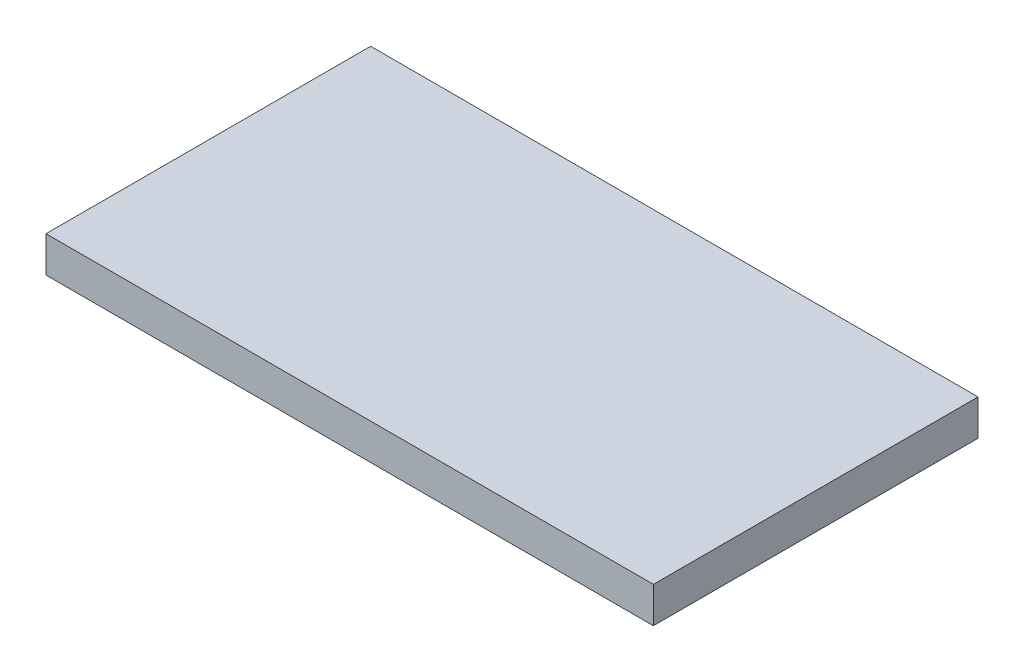
ISO-10303-21;
HEADER;
FILE_DESCRIPTION(('STEP AP214'),'2;1');
FILE_NAME('part.step','',(''),(''),'','','');
FILE_SCHEMA(('AUTOMOTIVE_DESIGN { 1 0 10303 214 1 1 1 1 }'));
ENDSEC;
DATA;
#1=APPLICATION_CONTEXT('core data for automotive mechanical design processes');
#2=APPLICATION_PROTOCOL_DEFINITION('international standard','automotive_design',2000,#1);
#3=PRODUCT_CONTEXT('',#1,'mechanical');
#4=PRODUCT('Part','Part','',(#3));
#5=PRODUCT_RELATED_PRODUCT_CATEGORY('part','',(#4));
#6=PRODUCT_DEFINITION_FORMATION('','',#4);
#7=PRODUCT_DEFINITION_CONTEXT('part definition',#1,'design');
#8=PRODUCT_DEFINITION('design','',#6,#7);
#9=PRODUCT_DEFINITION_SHAPE('','',#8);
#10=(LENGTH_UNIT() NAMED_UNIT(*) SI_UNIT(.MILLI.,.METRE.));
#11=(NAMED_UNIT(*) PLANE_ANGLE_UNIT() SI_UNIT($,.RADIAN.));
#12=(NAMED_UNIT(*) SI_UNIT($,.STERADIAN.) SOLID_ANGLE_UNIT());
#13=UNCERTAINTY_MEASURE_WITH_UNIT(LENGTH_MEASURE(1.E-05),#10,'distance_accuracy_value','');
#14=(GEOMETRIC_REPRESENTATION_CONTEXT(3) GLOBAL_UNCERTAINTY_ASSIGNED_CONTEXT((#13)) GLOBAL_UNIT_ASSIGNED_CONTEXT((#10,
#11,#12)) REPRESENTATION_CONTEXT('',''));
#15=CARTESIAN_POINT('',(0.,0.,0.));
#16=DIRECTION('',(0.,0.,1.));
#17=DIRECTION('',(1.,0.,0.));
#18=AXIS2_PLACEMENT_3D('',#15,#16,#17);
#19=CARTESIAN_POINT('',(21.5319484559132,2.54,11.508455209195));
#20=DIRECTION('',(-1.,0.,0.));
#21=DIRECTION('',(0.,0.,1.));
#22=AXIS2_PLACEMENT_3D('',#19,#20,#21);
#23=PLANE('',#22);
#24=DIRECTION('',(0.,0.,-1.));
#25=VECTOR('',#24,1.);
#26=CARTESIAN_POINT('',(21.5319484559132,0.,11.508455209195));
#27=LINE('',#26,#25);
#28=CARTESIAN_POINT('',(21.5319484559132,0.,11.508455209195));
#29=VERTEX_POINT('',#28);
#30=CARTESIAN_POINT('',(21.5319484559132,0.,-11.508455209195));
#31=VERTEX_POINT('',#30);
#32=EDGE_CURVE('E111',#29,#31,#27,.T.);
#33=ORIENTED_EDGE('',*,*,#32,.T.);
#34=DIRECTION('',(0.,-1.,0.));
#35=VECTOR('',#34,1.);
#36=CARTESIAN_POINT('',(21.5319484559132,2.54,-11.508455209195));
#37=LINE('',#36,#35);
#38=CARTESIAN_POINT('',(21.5319484559132,2.54,-11.508455209195));
#39=VERTEX_POINT('',#38);
#40=EDGE_CURVE('E11',#39,#31,#37,.T.);
#41=ORIENTED_EDGE('',*,*,#40,.F.);
#42=DIRECTION('',(0.,0.,-1.));
#43=VECTOR('',#42,1.);
#44=CARTESIAN_POINT('',(21.5319484559132,2.54,11.508455209195));
#45=LINE('',#44,#43);
#46=CARTESIAN_POINT('',(21.5319484559132,2.54,11.508455209195));
#47=VERTEX_POINT('',#46);
#48=EDGE_CURVE('E95',#47,#39,#45,.T.);
#49=ORIENTED_EDGE('',*,*,#48,.F.);
#50=DIRECTION('',(0.,-1.,0.));
#51=VECTOR('',#50,1.);
#52=CARTESIAN_POINT('',(21.5319484559132,2.54,11.508455209195));
#53=LINE('',#52,#51);
#54=EDGE_CURVE('E107',#47,#29,#53,.T.);
#55=ORIENTED_EDGE('',*,*,#54,.T.);
#56=EDGE_LOOP('',(#33,#41,#49,#55));
#57=FACE_BOUND('',#56,.T.);
#58=ADVANCED_FACE('F43',(#57),#23,.F.);
#59=CARTESIAN_POINT('',(-21.5319484559132,2.54,-11.508455209195));
#60=DIRECTION('',(0.,0.,1.));
#61=DIRECTION('',(1.,0.,0.));
#62=AXIS2_PLACEMENT_3D('',#59,#60,#61);
#63=PLANE('',#62);
#64=DIRECTION('',(-1.,0.,0.));
#65=VECTOR('',#64,1.);
#66=CARTESIAN_POINT('',(-21.5319484559132,0.,-11.508455209195));
#67=LINE('',#66,#65);
#68=CARTESIAN_POINT('',(-21.5319484559132,0.,-11.508455209195));
#69=VERTEX_POINT('',#68);
#70=EDGE_CURVE('E100',#31,#69,#67,.T.);
#71=ORIENTED_EDGE('',*,*,#70,.T.);
#72=DIRECTION('',(0.,-1.,0.));
#73=VECTOR('',#72,1.);
#74=CARTESIAN_POINT('',(-21.5319484559132,2.54,-11.508455209195));
#75=LINE('',#74,#73);
#76=CARTESIAN_POINT('',(-21.5319484559132,2.54,-11.508455209195));
#77=VERTEX_POINT('',#76);
#78=EDGE_CURVE('E52',#77,#69,#75,.T.);
#79=ORIENTED_EDGE('',*,*,#78,.F.);
#80=DIRECTION('',(-1.,0.,0.));
#81=VECTOR('',#80,1.);
#82=CARTESIAN_POINT('',(-21.5319484559132,2.54,-11.508455209195));
#83=LINE('',#82,#81);
#84=EDGE_CURVE('E90',#39,#77,#83,.T.);
#85=ORIENTED_EDGE('',*,*,#84,.F.);
#86=ORIENTED_EDGE('',*,*,#40,.T.);
#87=EDGE_LOOP('',(#71,#79,#85,#86));
#88=FACE_BOUND('',#87,.T.);
#89=ADVANCED_FACE('F99',(#88),#63,.F.);
#90=CARTESIAN_POINT('',(-21.5319484559132,2.54,11.508455209195));
#91=DIRECTION('',(1.,0.,0.));
#92=DIRECTION('',(0.,0.,-1.));
#93=AXIS2_PLACEMENT_3D('',#90,#91,#92);
#94=PLANE('',#93);
#95=DIRECTION('',(0.,0.,1.));
#96=VECTOR('',#95,1.);
#97=CARTESIAN_POINT('',(-21.5319484559132,0.,11.508455209195));
#98=LINE('',#97,#96);
#99=CARTESIAN_POINT('',(-21.5319484559132,0.,11.508455209195));
#100=VERTEX_POINT('',#99);
#101=EDGE_CURVE('E77',#69,#100,#98,.T.);
#102=ORIENTED_EDGE('',*,*,#101,.T.);
#103=DIRECTION('',(0.,-1.,0.));
#104=VECTOR('',#103,1.);
#105=CARTESIAN_POINT('',(-21.5319484559132,2.54,11.508455209195));
#106=LINE('',#105,#104);
#107=CARTESIAN_POINT('',(-21.5319484559132,2.54,11.508455209195));
#108=VERTEX_POINT('',#107);
#109=EDGE_CURVE('E102',#108,#100,#106,.T.);
#110=ORIENTED_EDGE('',*,*,#109,.F.);
#111=DIRECTION('',(0.,0.,1.));
#112=VECTOR('',#111,1.);
#113=CARTESIAN_POINT('',(-21.5319484559132,2.54,11.508455209195));
#114=LINE('',#113,#112);
#115=EDGE_CURVE('E93',#77,#108,#114,.T.);
#116=ORIENTED_EDGE('',*,*,#115,.F.);
#117=ORIENTED_EDGE('',*,*,#78,.T.);
#118=EDGE_LOOP('',(#102,#110,#116,#117));
#119=FACE_BOUND('',#118,.T.);
#120=ADVANCED_FACE('F103',(#119),#94,.F.);
#121=CARTESIAN_POINT('',(-21.5319484559132,2.54,11.508455209195));
#122=DIRECTION('',(0.,0.,-1.));
#123=DIRECTION('',(-1.,0.,0.));
#124=AXIS2_PLACEMENT_3D('',#121,#122,#123);
#125=PLANE('',#124);
#126=DIRECTION('',(1.,0.,0.));
#127=VECTOR('',#126,1.);
#128=CARTESIAN_POINT('',(-21.5319484559132,0.,11.508455209195));
#129=LINE('',#128,#127);
#130=EDGE_CURVE('E83',#100,#29,#129,.T.);
#131=ORIENTED_EDGE('',*,*,#130,.T.);
#132=ORIENTED_EDGE('',*,*,#54,.F.);
#133=DIRECTION('',(1.,0.,0.));
#134=VECTOR('',#133,1.);
#135=CARTESIAN_POINT('',(-21.5319484559132,2.54,11.508455209195));
#136=LINE('',#135,#134);
#137=EDGE_CURVE('E60',#108,#47,#136,.T.);
#138=ORIENTED_EDGE('',*,*,#137,.F.);
#139=ORIENTED_EDGE('',*,*,#109,.T.);
#140=EDGE_LOOP('',(#131,#132,#138,#139));
#141=FACE_BOUND('',#140,.T.);
#142=ADVANCED_FACE('F124',(#141),#125,.F.);
#143=CARTESIAN_POINT('',(0.,2.54,0.));
#144=DIRECTION('',(0.,-1.,0.));
#145=DIRECTION('',(0.,0.,-1.));
#146=AXIS2_PLACEMENT_3D('',#143,#144,#145);
#147=PLANE('',#146);
#148=ORIENTED_EDGE('',*,*,#48,.T.);
#149=ORIENTED_EDGE('',*,*,#84,.T.);
#150=ORIENTED_EDGE('',*,*,#115,.T.);
#151=ORIENTED_EDGE('',*,*,#137,.T.);
#152=EDGE_LOOP('',(#148,#149,#150,#151));
#153=FACE_BOUND('',#152,.T.);
#154=ADVANCED_FACE('F91',(#153),#147,.F.);
#155=CARTESIAN_POINT('',(0.,0.,0.));
#156=DIRECTION('',(0.,-1.,0.));
#157=DIRECTION('',(0.,0.,-1.));
#158=AXIS2_PLACEMENT_3D('',#155,#156,#157);
#159=PLANE('',#158);
#160=ORIENTED_EDGE('',*,*,#32,.F.);
#161=ORIENTED_EDGE('',*,*,#130,.F.);
#162=ORIENTED_EDGE('',*,*,#101,.F.);
#163=ORIENTED_EDGE('',*,*,#70,.F.);
#164=EDGE_LOOP('',(#160,#161,#162,#163));
#165=FACE_BOUND('',#164,.T.);
#166=ADVANCED_FACE('F127',(#165),#159,.T.);
#167=CLOSED_SHELL('',(#58,#89,#120,#142,#154,#166));
#168=MANIFOLD_SOLID_BREP('B2',#167);
#169=ADVANCED_BREP_SHAPE_REPRESENTATION('',(#18,#168),#14);
#170=SHAPE_DEFINITION_REPRESENTATION(#9,#169);
ENDSEC;
END-ISO-10303-21;
